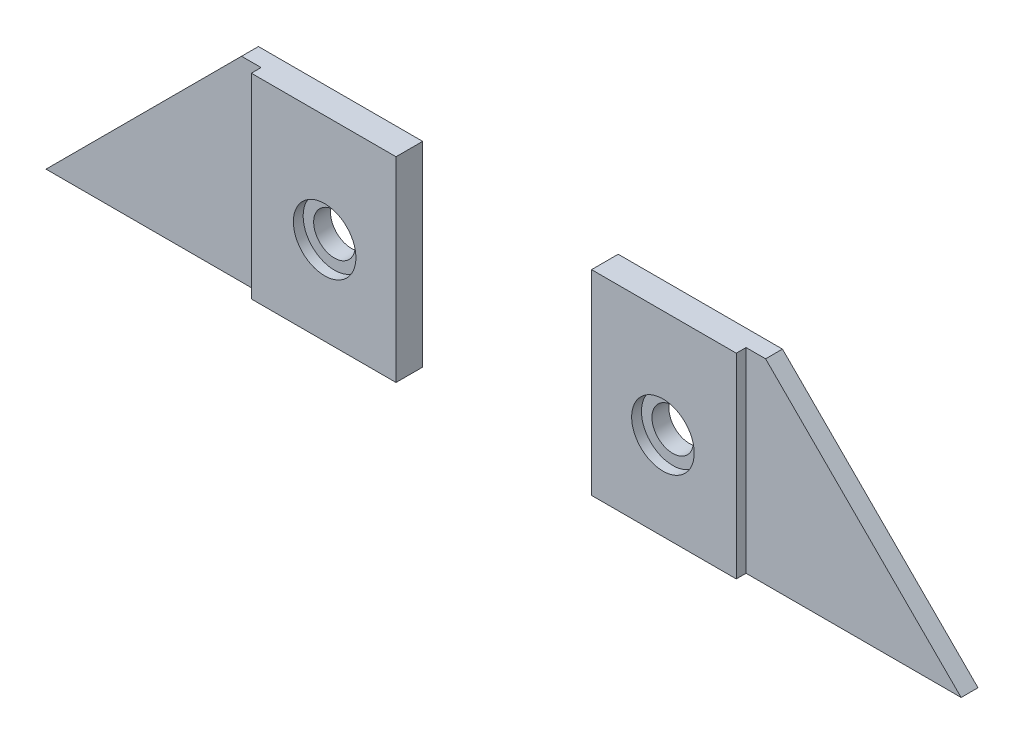
ISO-10303-21;
HEADER;
FILE_DESCRIPTION(('STEP AP214'),'2;1');
FILE_NAME('part.step','',(''),(''),'','','');
FILE_SCHEMA(('AUTOMOTIVE_DESIGN { 1 0 10303 214 1 1 1 1 }'));
ENDSEC;
DATA;
#1=APPLICATION_CONTEXT('core data for automotive mechanical design processes');
#2=APPLICATION_PROTOCOL_DEFINITION('international standard','automotive_design',2000,#1);
#3=PRODUCT_CONTEXT('',#1,'mechanical');
#4=PRODUCT('Part','Part','',(#3));
#5=PRODUCT_RELATED_PRODUCT_CATEGORY('part','',(#4));
#6=PRODUCT_DEFINITION_FORMATION('','',#4);
#7=PRODUCT_DEFINITION_CONTEXT('part definition',#1,'design');
#8=PRODUCT_DEFINITION('design','',#6,#7);
#9=PRODUCT_DEFINITION_SHAPE('','',#8);
#10=(LENGTH_UNIT() NAMED_UNIT(*) SI_UNIT(.MILLI.,.METRE.));
#11=(NAMED_UNIT(*) PLANE_ANGLE_UNIT() SI_UNIT($,.RADIAN.));
#12=(NAMED_UNIT(*) SI_UNIT($,.STERADIAN.) SOLID_ANGLE_UNIT());
#13=UNCERTAINTY_MEASURE_WITH_UNIT(LENGTH_MEASURE(1.E-05),#10,'distance_accuracy_value','');
#14=(GEOMETRIC_REPRESENTATION_CONTEXT(3) GLOBAL_UNCERTAINTY_ASSIGNED_CONTEXT((#13)) GLOBAL_UNIT_ASSIGNED_CONTEXT((#10,
#11,#12)) REPRESENTATION_CONTEXT('',''));
#15=CARTESIAN_POINT('',(0.,0.,0.));
#16=DIRECTION('',(0.,0.,1.));
#17=DIRECTION('',(1.,0.,0.));
#18=AXIS2_PLACEMENT_3D('',#15,#16,#17);
#19=CARTESIAN_POINT('',(-45.7,-1.,-1.6375));
#20=DIRECTION('',(0.,0.,1.));
#21=DIRECTION('',(-1.,0.,0.));
#22=AXIS2_PLACEMENT_3D('',#19,#20,#21);
#23=CYLINDRICAL_SURFACE('',#22,2.125);
#24=CARTESIAN_POINT('',(-45.7,-1.,-1.3625));
#25=DIRECTION('',(0.,0.,1.));
#26=DIRECTION('',(1.,0.,0.));
#27=AXIS2_PLACEMENT_3D('',#24,#25,#26);
#28=CIRCLE('',#27,2.125);
#29=CARTESIAN_POINT('',(-43.575,-1.,-1.3625));
#30=VERTEX_POINT('',#29);
#31=EDGE_CURVE('E116',#30,#30,#28,.T.);
#32=ORIENTED_EDGE('',*,*,#31,.F.);
#33=EDGE_LOOP('',(#32));
#34=FACE_BOUND('',#33,.T.);
#35=CARTESIAN_POINT('',(-45.7,-1.,0.362500000000002));
#36=DIRECTION('',(0.,0.,-1.));
#37=DIRECTION('',(-1.,0.,0.));
#38=AXIS2_PLACEMENT_3D('',#35,#36,#37);
#39=CIRCLE('',#38,2.125);
#40=CARTESIAN_POINT('',(-47.825,-1.,0.362500000000002));
#41=VERTEX_POINT('',#40);
#42=EDGE_CURVE('E46',#41,#41,#39,.F.);
#43=ORIENTED_EDGE('',*,*,#42,.T.);
#44=EDGE_LOOP('',(#43));
#45=FACE_BOUND('',#44,.T.);
#46=ADVANCED_FACE('F42',(#34,#45),#23,.F.);
#47=CARTESIAN_POINT('',(-53.2,-10.,0.362500000000002));
#48=DIRECTION('',(-1.,0.,0.));
#49=DIRECTION('',(0.,0.,-1.));
#50=AXIS2_PLACEMENT_3D('',#47,#48,#49);
#51=PLANE('',#50);
#52=DIRECTION('',(0.,1.,0.));
#53=VECTOR('',#52,1.);
#54=CARTESIAN_POINT('',(-53.2,-10.,0.362500000000002));
#55=LINE('',#54,#53);
#56=CARTESIAN_POINT('',(-53.2,-10.,0.362500000000002));
#57=VERTEX_POINT('',#56);
#58=CARTESIAN_POINT('',(-53.2,10.,0.362500000000002));
#59=VERTEX_POINT('',#58);
#60=EDGE_CURVE('E109',#57,#59,#55,.T.);
#61=ORIENTED_EDGE('',*,*,#60,.F.);
#62=DIRECTION('',(0.,0.,-1.));
#63=VECTOR('',#62,1.);
#64=CARTESIAN_POINT('',(-53.2,-10.,0.362500000000002));
#65=LINE('',#64,#63);
#66=CARTESIAN_POINT('',(-53.2,-10.,1.3625));
#67=VERTEX_POINT('',#66);
#68=EDGE_CURVE('E130',#67,#57,#65,.T.);
#69=ORIENTED_EDGE('',*,*,#68,.F.);
#70=DIRECTION('',(0.,1.,0.));
#71=VECTOR('',#70,1.);
#72=CARTESIAN_POINT('',(-53.2,-10.,1.3625));
#73=LINE('',#72,#71);
#74=CARTESIAN_POINT('',(-53.2,10.,1.3625));
#75=VERTEX_POINT('',#74);
#76=EDGE_CURVE('E51',#67,#75,#73,.T.);
#77=ORIENTED_EDGE('',*,*,#76,.T.);
#78=DIRECTION('',(0.,0.,-1.));
#79=VECTOR('',#78,1.);
#80=CARTESIAN_POINT('',(-53.2,10.,0.362500000000002));
#81=LINE('',#80,#79);
#82=EDGE_CURVE('E110',#75,#59,#81,.T.);
#83=ORIENTED_EDGE('',*,*,#82,.T.);
#84=EDGE_LOOP('',(#61,#69,#77,#83));
#85=FACE_BOUND('',#84,.T.);
#86=ADVANCED_FACE('F44',(#85),#51,.T.);
#87=CARTESIAN_POINT('',(-38.4,-10.,1.3625));
#88=DIRECTION('',(0.,0.,1.));
#89=DIRECTION('',(-1.,0.,0.));
#90=AXIS2_PLACEMENT_3D('',#87,#88,#89);
#91=PLANE('',#90);
#92=CARTESIAN_POINT('',(-45.7,-1.,1.3625));
#93=DIRECTION('',(0.,0.,-1.));
#94=DIRECTION('',(-1.,0.,0.));
#95=AXIS2_PLACEMENT_3D('',#92,#93,#94);
#96=CIRCLE('',#95,3.2);
#97=CARTESIAN_POINT('',(-48.9,-1.,1.3625));
#98=VERTEX_POINT('',#97);
#99=EDGE_CURVE('E121',#98,#98,#96,.T.);
#100=ORIENTED_EDGE('',*,*,#99,.T.);
#101=EDGE_LOOP('',(#100));
#102=FACE_BOUND('',#101,.T.);
#103=ORIENTED_EDGE('',*,*,#76,.F.);
#104=DIRECTION('',(-1.,0.,0.));
#105=VECTOR('',#104,1.);
#106=CARTESIAN_POINT('',(-38.4,-10.,1.3625));
#107=LINE('',#106,#105);
#108=CARTESIAN_POINT('',(-38.4,-10.,1.3625));
#109=VERTEX_POINT('',#108);
#110=EDGE_CURVE('E65',#109,#67,#107,.T.);
#111=ORIENTED_EDGE('',*,*,#110,.F.);
#112=DIRECTION('',(0.,1.,0.));
#113=VECTOR('',#112,1.);
#114=CARTESIAN_POINT('',(-38.4,-10.,1.3625));
#115=LINE('',#114,#113);
#116=CARTESIAN_POINT('',(-38.4,10.,1.3625));
#117=VERTEX_POINT('',#116);
#118=EDGE_CURVE('E142',#109,#117,#115,.T.);
#119=ORIENTED_EDGE('',*,*,#118,.T.);
#120=DIRECTION('',(-1.,0.,0.));
#121=VECTOR('',#120,1.);
#122=CARTESIAN_POINT('',(-38.4,10.,1.3625));
#123=LINE('',#122,#121);
#124=EDGE_CURVE('E128',#117,#75,#123,.T.);
#125=ORIENTED_EDGE('',*,*,#124,.T.);
#126=EDGE_LOOP('',(#103,#111,#119,#125));
#127=FACE_BOUND('',#126,.T.);
#128=ADVANCED_FACE('F158',(#102,#127),#91,.T.);
#129=CARTESIAN_POINT('',(-38.4,-10.,-1.3625));
#130=DIRECTION('',(1.,0.,0.));
#131=DIRECTION('',(0.,0.,1.));
#132=AXIS2_PLACEMENT_3D('',#129,#130,#131);
#133=PLANE('',#132);
#134=ORIENTED_EDGE('',*,*,#118,.F.);
#135=DIRECTION('',(0.,0.,1.));
#136=VECTOR('',#135,1.);
#137=CARTESIAN_POINT('',(-38.4,-10.,-1.3625));
#138=LINE('',#137,#136);
#139=CARTESIAN_POINT('',(-38.4,-10.,-1.3625));
#140=VERTEX_POINT('',#139);
#141=EDGE_CURVE('E137',#140,#109,#138,.T.);
#142=ORIENTED_EDGE('',*,*,#141,.F.);
#143=DIRECTION('',(0.,1.,0.));
#144=VECTOR('',#143,1.);
#145=CARTESIAN_POINT('',(-38.4,-10.,-1.3625));
#146=LINE('',#145,#144);
#147=CARTESIAN_POINT('',(-38.4,10.,-1.3625));
#148=VERTEX_POINT('',#147);
#149=EDGE_CURVE('E145',#140,#148,#146,.T.);
#150=ORIENTED_EDGE('',*,*,#149,.T.);
#151=DIRECTION('',(0.,0.,1.));
#152=VECTOR('',#151,1.);
#153=CARTESIAN_POINT('',(-38.4,10.,-1.3625));
#154=LINE('',#153,#152);
#155=EDGE_CURVE('E126',#148,#117,#154,.T.);
#156=ORIENTED_EDGE('',*,*,#155,.T.);
#157=EDGE_LOOP('',(#134,#142,#150,#156));
#158=FACE_BOUND('',#157,.T.);
#159=ADVANCED_FACE('F152',(#158),#133,.T.);
#160=CARTESIAN_POINT('',(-38.4,-10.,-1.3625));
#161=DIRECTION('',(0.,0.,-1.));
#162=DIRECTION('',(1.,0.,0.));
#163=AXIS2_PLACEMENT_3D('',#160,#161,#162);
#164=PLANE('',#163);
#165=ORIENTED_EDGE('',*,*,#31,.T.);
#166=EDGE_LOOP('',(#165));
#167=FACE_BOUND('',#166,.T.);
#168=DIRECTION('',(0.707106781186548,0.707106781186548,0.));
#169=VECTOR('',#168,1.);
#170=CARTESIAN_POINT('',(-56.8,8.4,-1.3625));
#171=LINE('',#170,#169);
#172=CARTESIAN_POINT('',(-75.2,-10.,-1.3625));
#173=VERTEX_POINT('',#172);
#174=CARTESIAN_POINT('',(-55.2,10.,-1.3625));
#175=VERTEX_POINT('',#174);
#176=EDGE_CURVE('E115',#173,#175,#171,.T.);
#177=ORIENTED_EDGE('',*,*,#176,.T.);
#178=DIRECTION('',(1.,0.,0.));
#179=VECTOR('',#178,1.);
#180=CARTESIAN_POINT('',(-38.4,10.,-1.3625));
#181=LINE('',#180,#179);
#182=EDGE_CURVE('E101',#175,#148,#181,.T.);
#183=ORIENTED_EDGE('',*,*,#182,.T.);
#184=ORIENTED_EDGE('',*,*,#149,.F.);
#185=DIRECTION('',(1.,0.,0.));
#186=VECTOR('',#185,1.);
#187=CARTESIAN_POINT('',(-38.4,-10.,-1.3625));
#188=LINE('',#187,#186);
#189=EDGE_CURVE('E135',#173,#140,#188,.T.);
#190=ORIENTED_EDGE('',*,*,#189,.F.);
#191=EDGE_LOOP('',(#177,#183,#184,#190));
#192=FACE_BOUND('',#191,.T.);
#193=ADVANCED_FACE('F156',(#167,#192),#164,.T.);
#194=CARTESIAN_POINT('',(-53.2,-10.,0.362500000000002));
#195=DIRECTION('',(0.,0.,1.));
#196=DIRECTION('',(-1.,0.,0.));
#197=AXIS2_PLACEMENT_3D('',#194,#195,#196);
#198=PLANE('',#197);
#199=DIRECTION('',(-0.707106781186548,-0.707106781186548,0.));
#200=VECTOR('',#199,1.);
#201=CARTESIAN_POINT('',(-55.2,10.,0.362500000000002));
#202=LINE('',#201,#200);
#203=CARTESIAN_POINT('',(-55.2,10.,0.362500000000002));
#204=VERTEX_POINT('',#203);
#205=CARTESIAN_POINT('',(-75.2,-10.,0.362500000000002));
#206=VERTEX_POINT('',#205);
#207=EDGE_CURVE('E107',#204,#206,#202,.T.);
#208=ORIENTED_EDGE('',*,*,#207,.T.);
#209=DIRECTION('',(-1.,0.,0.));
#210=VECTOR('',#209,1.);
#211=CARTESIAN_POINT('',(-53.2,-10.,0.362500000000002));
#212=LINE('',#211,#210);
#213=EDGE_CURVE('E132',#57,#206,#212,.T.);
#214=ORIENTED_EDGE('',*,*,#213,.F.);
#215=ORIENTED_EDGE('',*,*,#60,.T.);
#216=DIRECTION('',(-1.,0.,0.));
#217=VECTOR('',#216,1.);
#218=CARTESIAN_POINT('',(-53.2,10.,0.362500000000002));
#219=LINE('',#218,#217);
#220=EDGE_CURVE('E98',#59,#204,#219,.T.);
#221=ORIENTED_EDGE('',*,*,#220,.T.);
#222=EDGE_LOOP('',(#208,#214,#215,#221));
#223=FACE_BOUND('',#222,.T.);
#224=ADVANCED_FACE('F106',(#223),#198,.T.);
#225=CARTESIAN_POINT('',(-56.8,-10.,0.));
#226=DIRECTION('',(0.,1.,0.));
#227=DIRECTION('',(0.,0.,1.));
#228=AXIS2_PLACEMENT_3D('',#225,#226,#227);
#229=PLANE('',#228);
#230=ORIENTED_EDGE('',*,*,#68,.T.);
#231=ORIENTED_EDGE('',*,*,#213,.T.);
#232=DIRECTION('',(0.,0.,-1.));
#233=VECTOR('',#232,1.);
#234=CARTESIAN_POINT('',(-75.2,-10.,-1.3625));
#235=LINE('',#234,#233);
#236=EDGE_CURVE('E113',#206,#173,#235,.T.);
#237=ORIENTED_EDGE('',*,*,#236,.T.);
#238=ORIENTED_EDGE('',*,*,#189,.T.);
#239=ORIENTED_EDGE('',*,*,#141,.T.);
#240=ORIENTED_EDGE('',*,*,#110,.T.);
#241=EDGE_LOOP('',(#230,#231,#237,#238,#239,#240));
#242=FACE_BOUND('',#241,.T.);
#243=ADVANCED_FACE('F161',(#242),#229,.F.);
#244=CARTESIAN_POINT('',(-56.8,10.,0.));
#245=DIRECTION('',(0.,1.,0.));
#246=DIRECTION('',(0.,0.,1.));
#247=AXIS2_PLACEMENT_3D('',#244,#245,#246);
#248=PLANE('',#247);
#249=DIRECTION('',(0.,0.,1.));
#250=VECTOR('',#249,1.);
#251=CARTESIAN_POINT('',(-55.2,10.,0.));
#252=LINE('',#251,#250);
#253=EDGE_CURVE('E12',#175,#204,#252,.T.);
#254=ORIENTED_EDGE('',*,*,#253,.T.);
#255=ORIENTED_EDGE('',*,*,#220,.F.);
#256=ORIENTED_EDGE('',*,*,#82,.F.);
#257=ORIENTED_EDGE('',*,*,#124,.F.);
#258=ORIENTED_EDGE('',*,*,#155,.F.);
#259=ORIENTED_EDGE('',*,*,#182,.F.);
#260=EDGE_LOOP('',(#254,#255,#256,#257,#258,#259));
#261=FACE_BOUND('',#260,.T.);
#262=ADVANCED_FACE('F96',(#261),#248,.T.);
#263=CARTESIAN_POINT('',(-55.2,10.,-1.6375));
#264=DIRECTION('',(0.707106781186547,-0.707106781186547,0.));
#265=DIRECTION('',(-0.707106781186548,-0.707106781186548,0.));
#266=AXIS2_PLACEMENT_3D('',#263,#264,#265);
#267=PLANE('',#266);
#268=ORIENTED_EDGE('',*,*,#176,.F.);
#269=ORIENTED_EDGE('',*,*,#236,.F.);
#270=ORIENTED_EDGE('',*,*,#207,.F.);
#271=ORIENTED_EDGE('',*,*,#253,.F.);
#272=EDGE_LOOP('',(#268,#269,#270,#271));
#273=FACE_BOUND('',#272,.T.);
#274=ADVANCED_FACE('F112',(#273),#267,.F.);
#275=CARTESIAN_POINT('',(-45.7,-1.,0.362500000000002));
#276=DIRECTION('',(0.,0.,1.));
#277=DIRECTION('',(-1.,0.,0.));
#278=AXIS2_PLACEMENT_3D('',#275,#276,#277);
#279=PLANE('',#278);
#280=CARTESIAN_POINT('',(-45.7,-1.,0.362500000000002));
#281=DIRECTION('',(0.,0.,-1.));
#282=DIRECTION('',(-1.,0.,0.));
#283=AXIS2_PLACEMENT_3D('',#280,#281,#282);
#284=CIRCLE('',#283,3.2);
#285=CARTESIAN_POINT('',(-48.9,-1.,0.362500000000002));
#286=VERTEX_POINT('',#285);
#287=EDGE_CURVE('E195',#286,#286,#284,.T.);
#288=ORIENTED_EDGE('',*,*,#287,.F.);
#289=EDGE_LOOP('',(#288));
#290=FACE_BOUND('',#289,.T.);
#291=ORIENTED_EDGE('',*,*,#42,.F.);
#292=EDGE_LOOP('',(#291));
#293=FACE_BOUND('',#292,.T.);
#294=ADVANCED_FACE('F183',(#290,#293),#279,.T.);
#295=CARTESIAN_POINT('',(-45.7,-1.,0.362500000000002));
#296=DIRECTION('',(0.,0.,1.));
#297=DIRECTION('',(-1.,0.,0.));
#298=AXIS2_PLACEMENT_3D('',#295,#296,#297);
#299=CYLINDRICAL_SURFACE('',#298,3.2);
#300=ORIENTED_EDGE('',*,*,#287,.T.);
#301=EDGE_LOOP('',(#300));
#302=FACE_BOUND('',#301,.T.);
#303=ORIENTED_EDGE('',*,*,#99,.F.);
#304=EDGE_LOOP('',(#303));
#305=FACE_BOUND('',#304,.T.);
#306=ADVANCED_FACE('F180',(#302,#305),#299,.F.);
#307=CLOSED_SHELL('',(#46,#86,#128,#159,#193,#224,#243,#262,#274,#294,#306));
#308=MANIFOLD_SOLID_BREP('B2',#307);
#309=CARTESIAN_POINT('',(-11.1,-1.,-1.6375));
#310=DIRECTION('',(0.,0.,1.));
#311=DIRECTION('',(1.,0.,0.));
#312=AXIS2_PLACEMENT_3D('',#309,#310,#311);
#313=CYLINDRICAL_SURFACE('',#312,2.125);
#314=CARTESIAN_POINT('',(-11.1,-1.,-1.3625));
#315=DIRECTION('',(0.,0.,-1.));
#316=DIRECTION('',(-1.,0.,0.));
#317=AXIS2_PLACEMENT_3D('',#314,#315,#316);
#318=CIRCLE('',#317,2.125);
#319=CARTESIAN_POINT('',(-13.225,-1.,-1.3625));
#320=VERTEX_POINT('',#319);
#321=EDGE_CURVE('E334',#320,#320,#318,.T.);
#322=ORIENTED_EDGE('',*,*,#321,.T.);
#323=EDGE_LOOP('',(#322));
#324=FACE_BOUND('',#323,.T.);
#325=CARTESIAN_POINT('',(-11.1,-1.,0.362500000000002));
#326=DIRECTION('',(0.,0.,1.));
#327=DIRECTION('',(1.,0.,0.));
#328=AXIS2_PLACEMENT_3D('',#325,#326,#327);
#329=CIRCLE('',#328,2.125);
#330=CARTESIAN_POINT('',(-8.975,-1.,0.362500000000002));
#331=VERTEX_POINT('',#330);
#332=EDGE_CURVE('E272',#331,#331,#329,.F.);
#333=ORIENTED_EDGE('',*,*,#332,.F.);
#334=EDGE_LOOP('',(#333));
#335=FACE_BOUND('',#334,.T.);
#336=ADVANCED_FACE('F268',(#324,#335),#313,.F.);
#337=CARTESIAN_POINT('',(-3.6,-10.,0.362500000000002));
#338=DIRECTION('',(1.,0.,0.));
#339=DIRECTION('',(0.,0.,-1.));
#340=AXIS2_PLACEMENT_3D('',#337,#338,#339);
#341=PLANE('',#340);
#342=DIRECTION('',(0.,1.,0.));
#343=VECTOR('',#342,1.);
#344=CARTESIAN_POINT('',(-3.6,-10.,0.362500000000002));
#345=LINE('',#344,#343);
#346=CARTESIAN_POINT('',(-3.6,-10.,0.362500000000002));
#347=VERTEX_POINT('',#346);
#348=CARTESIAN_POINT('',(-3.6,10.,0.362500000000002));
#349=VERTEX_POINT('',#348);
#350=EDGE_CURVE('E364',#347,#349,#345,.T.);
#351=ORIENTED_EDGE('',*,*,#350,.T.);
#352=DIRECTION('',(0.,0.,-1.));
#353=VECTOR('',#352,1.);
#354=CARTESIAN_POINT('',(-3.6,10.,0.362500000000002));
#355=LINE('',#354,#353);
#356=CARTESIAN_POINT('',(-3.6,10.,1.3625));
#357=VERTEX_POINT('',#356);
#358=EDGE_CURVE('E338',#357,#349,#355,.T.);
#359=ORIENTED_EDGE('',*,*,#358,.F.);
#360=DIRECTION('',(0.,1.,0.));
#361=VECTOR('',#360,1.);
#362=CARTESIAN_POINT('',(-3.6,-10.,1.3625));
#363=LINE('',#362,#361);
#364=CARTESIAN_POINT('',(-3.6,-10.,1.3625));
#365=VERTEX_POINT('',#364);
#366=EDGE_CURVE('E277',#365,#357,#363,.T.);
#367=ORIENTED_EDGE('',*,*,#366,.F.);
#368=DIRECTION('',(0.,0.,-1.));
#369=VECTOR('',#368,1.);
#370=CARTESIAN_POINT('',(-3.6,-10.,0.362500000000002));
#371=LINE('',#370,#369);
#372=EDGE_CURVE('E350',#365,#347,#371,.T.);
#373=ORIENTED_EDGE('',*,*,#372,.T.);
#374=EDGE_LOOP('',(#351,#359,#367,#373));
#375=FACE_BOUND('',#374,.T.);
#376=ADVANCED_FACE('F270',(#375),#341,.T.);
#377=CARTESIAN_POINT('',(-18.4,-10.,1.3625));
#378=DIRECTION('',(0.,0.,1.));
#379=DIRECTION('',(1.,0.,0.));
#380=AXIS2_PLACEMENT_3D('',#377,#378,#379);
#381=PLANE('',#380);
#382=CARTESIAN_POINT('',(-11.1,-1.,1.3625));
#383=DIRECTION('',(0.,0.,1.));
#384=DIRECTION('',(1.,0.,0.));
#385=AXIS2_PLACEMENT_3D('',#382,#383,#384);
#386=CIRCLE('',#385,3.2);
#387=CARTESIAN_POINT('',(-7.9,-1.,1.3625));
#388=VERTEX_POINT('',#387);
#389=EDGE_CURVE('E379',#388,#388,#386,.T.);
#390=ORIENTED_EDGE('',*,*,#389,.F.);
#391=EDGE_LOOP('',(#390));
#392=FACE_BOUND('',#391,.T.);
#393=ORIENTED_EDGE('',*,*,#366,.T.);
#394=DIRECTION('',(1.,0.,0.));
#395=VECTOR('',#394,1.);
#396=CARTESIAN_POINT('',(-18.4,10.,1.3625));
#397=LINE('',#396,#395);
#398=CARTESIAN_POINT('',(-18.4,10.,1.3625));
#399=VERTEX_POINT('',#398);
#400=EDGE_CURVE('E348',#399,#357,#397,.T.);
#401=ORIENTED_EDGE('',*,*,#400,.F.);
#402=DIRECTION('',(0.,1.,0.));
#403=VECTOR('',#402,1.);
#404=CARTESIAN_POINT('',(-18.4,-10.,1.3625));
#405=LINE('',#404,#403);
#406=CARTESIAN_POINT('',(-18.4,-10.,1.3625));
#407=VERTEX_POINT('',#406);
#408=EDGE_CURVE('E366',#407,#399,#405,.T.);
#409=ORIENTED_EDGE('',*,*,#408,.F.);
#410=DIRECTION('',(1.,0.,0.));
#411=VECTOR('',#410,1.);
#412=CARTESIAN_POINT('',(-18.4,-10.,1.3625));
#413=LINE('',#412,#411);
#414=EDGE_CURVE('E361',#407,#365,#413,.T.);
#415=ORIENTED_EDGE('',*,*,#414,.T.);
#416=EDGE_LOOP('',(#393,#401,#409,#415));
#417=FACE_BOUND('',#416,.T.);
#418=ADVANCED_FACE('F389',(#392,#417),#381,.T.);
#419=CARTESIAN_POINT('',(-18.4,-10.,-1.3625));
#420=DIRECTION('',(-1.,0.,0.));
#421=DIRECTION('',(0.,0.,1.));
#422=AXIS2_PLACEMENT_3D('',#419,#420,#421);
#423=PLANE('',#422);
#424=ORIENTED_EDGE('',*,*,#408,.T.);
#425=DIRECTION('',(0.,0.,1.));
#426=VECTOR('',#425,1.);
#427=CARTESIAN_POINT('',(-18.4,10.,-1.3625));
#428=LINE('',#427,#426);
#429=CARTESIAN_POINT('',(-18.4,10.,-1.3625));
#430=VERTEX_POINT('',#429);
#431=EDGE_CURVE('E341',#430,#399,#428,.T.);
#432=ORIENTED_EDGE('',*,*,#431,.F.);
#433=DIRECTION('',(0.,1.,0.));
#434=VECTOR('',#433,1.);
#435=CARTESIAN_POINT('',(-18.4,-10.,-1.3625));
#436=LINE('',#435,#434);
#437=CARTESIAN_POINT('',(-18.4,-10.,-1.3625));
#438=VERTEX_POINT('',#437);
#439=EDGE_CURVE('E368',#438,#430,#436,.T.);
#440=ORIENTED_EDGE('',*,*,#439,.F.);
#441=DIRECTION('',(0.,0.,1.));
#442=VECTOR('',#441,1.);
#443=CARTESIAN_POINT('',(-18.4,-10.,-1.3625));
#444=LINE('',#443,#442);
#445=EDGE_CURVE('E358',#438,#407,#444,.T.);
#446=ORIENTED_EDGE('',*,*,#445,.T.);
#447=EDGE_LOOP('',(#424,#432,#440,#446));
#448=FACE_BOUND('',#447,.T.);
#449=ADVANCED_FACE('F392',(#448),#423,.T.);
#450=CARTESIAN_POINT('',(-18.4,-10.,-1.3625));
#451=DIRECTION('',(0.,0.,-1.));
#452=DIRECTION('',(-1.,0.,0.));
#453=AXIS2_PLACEMENT_3D('',#450,#451,#452);
#454=PLANE('',#453);
#455=ORIENTED_EDGE('',*,*,#321,.F.);
#456=EDGE_LOOP('',(#455));
#457=FACE_BOUND('',#456,.T.);
#458=DIRECTION('',(-0.707106781186548,0.707106781186548,0.));
#459=VECTOR('',#458,1.);
#460=CARTESIAN_POINT('',(0.,8.4,-1.3625));
#461=LINE('',#460,#459);
#462=CARTESIAN_POINT('',(18.4,-10.,-1.3625));
#463=VERTEX_POINT('',#462);
#464=CARTESIAN_POINT('',(-1.6,10.,-1.3625));
#465=VERTEX_POINT('',#464);
#466=EDGE_CURVE('E284',#463,#465,#461,.T.);
#467=ORIENTED_EDGE('',*,*,#466,.F.);
#468=DIRECTION('',(-1.,0.,0.));
#469=VECTOR('',#468,1.);
#470=CARTESIAN_POINT('',(-18.4,-10.,-1.3625));
#471=LINE('',#470,#469);
#472=EDGE_CURVE('E355',#463,#438,#471,.T.);
#473=ORIENTED_EDGE('',*,*,#472,.T.);
#474=ORIENTED_EDGE('',*,*,#439,.T.);
#475=DIRECTION('',(-1.,0.,0.));
#476=VECTOR('',#475,1.);
#477=CARTESIAN_POINT('',(-18.4,10.,-1.3625));
#478=LINE('',#477,#476);
#479=EDGE_CURVE('E339',#465,#430,#478,.T.);
#480=ORIENTED_EDGE('',*,*,#479,.F.);
#481=EDGE_LOOP('',(#467,#473,#474,#480));
#482=FACE_BOUND('',#481,.T.);
#483=ADVANCED_FACE('F402',(#457,#482),#454,.T.);
#484=CARTESIAN_POINT('',(-3.6,-10.,0.362500000000002));
#485=DIRECTION('',(0.,0.,1.));
#486=DIRECTION('',(1.,0.,0.));
#487=AXIS2_PLACEMENT_3D('',#484,#485,#486);
#488=PLANE('',#487);
#489=DIRECTION('',(0.707106781186548,-0.707106781186548,0.));
#490=VECTOR('',#489,1.);
#491=CARTESIAN_POINT('',(-1.6,10.,0.362500000000002));
#492=LINE('',#491,#490);
#493=CARTESIAN_POINT('',(-1.6,10.,0.362500000000002));
#494=VERTEX_POINT('',#493);
#495=CARTESIAN_POINT('',(18.4,-10.,0.362500000000002));
#496=VERTEX_POINT('',#495);
#497=EDGE_CURVE('E321',#494,#496,#492,.T.);
#498=ORIENTED_EDGE('',*,*,#497,.F.);
#499=DIRECTION('',(1.,0.,0.));
#500=VECTOR('',#499,1.);
#501=CARTESIAN_POINT('',(-3.6,10.,0.362500000000002));
#502=LINE('',#501,#500);
#503=EDGE_CURVE('E330',#349,#494,#502,.T.);
#504=ORIENTED_EDGE('',*,*,#503,.F.);
#505=ORIENTED_EDGE('',*,*,#350,.F.);
#506=DIRECTION('',(1.,0.,0.));
#507=VECTOR('',#506,1.);
#508=CARTESIAN_POINT('',(-3.6,-10.,0.362500000000002));
#509=LINE('',#508,#507);
#510=EDGE_CURVE('E333',#347,#496,#509,.T.);
#511=ORIENTED_EDGE('',*,*,#510,.T.);
#512=EDGE_LOOP('',(#498,#504,#505,#511));
#513=FACE_BOUND('',#512,.T.);
#514=ADVANCED_FACE('F329',(#513),#488,.T.);
#515=CARTESIAN_POINT('',(0.,-10.,0.));
#516=DIRECTION('',(0.,1.,0.));
#517=DIRECTION('',(0.,0.,1.));
#518=AXIS2_PLACEMENT_3D('',#515,#516,#517);
#519=PLANE('',#518);
#520=ORIENTED_EDGE('',*,*,#372,.F.);
#521=ORIENTED_EDGE('',*,*,#414,.F.);
#522=ORIENTED_EDGE('',*,*,#445,.F.);
#523=ORIENTED_EDGE('',*,*,#472,.F.);
#524=DIRECTION('',(0.,0.,-1.));
#525=VECTOR('',#524,1.);
#526=CARTESIAN_POINT('',(18.4,-10.,-1.3625));
#527=LINE('',#526,#525);
#528=EDGE_CURVE('E353',#496,#463,#527,.T.);
#529=ORIENTED_EDGE('',*,*,#528,.F.);
#530=ORIENTED_EDGE('',*,*,#510,.F.);
#531=EDGE_LOOP('',(#520,#521,#522,#523,#529,#530));
#532=FACE_BOUND('',#531,.T.);
#533=ADVANCED_FACE('F398',(#532),#519,.F.);
#534=CARTESIAN_POINT('',(0.,10.,0.));
#535=DIRECTION('',(0.,1.,0.));
#536=DIRECTION('',(0.,0.,1.));
#537=AXIS2_PLACEMENT_3D('',#534,#535,#536);
#538=PLANE('',#537);
#539=DIRECTION('',(0.,0.,1.));
#540=VECTOR('',#539,1.);
#541=CARTESIAN_POINT('',(-1.6,10.,0.));
#542=LINE('',#541,#540);
#543=EDGE_CURVE('E40',#465,#494,#542,.T.);
#544=ORIENTED_EDGE('',*,*,#543,.F.);
#545=ORIENTED_EDGE('',*,*,#479,.T.);
#546=ORIENTED_EDGE('',*,*,#431,.T.);
#547=ORIENTED_EDGE('',*,*,#400,.T.);
#548=ORIENTED_EDGE('',*,*,#358,.T.);
#549=ORIENTED_EDGE('',*,*,#503,.T.);
#550=EDGE_LOOP('',(#544,#545,#546,#547,#548,#549));
#551=FACE_BOUND('',#550,.T.);
#552=ADVANCED_FACE('F336',(#551),#538,.T.);
#553=CARTESIAN_POINT('',(-1.6,10.,-1.6375));
#554=DIRECTION('',(-0.707106781186547,-0.707106781186547,0.));
#555=DIRECTION('',(0.707106781186548,-0.707106781186548,0.));
#556=AXIS2_PLACEMENT_3D('',#553,#554,#555);
#557=PLANE('',#556);
#558=ORIENTED_EDGE('',*,*,#466,.T.);
#559=ORIENTED_EDGE('',*,*,#543,.T.);
#560=ORIENTED_EDGE('',*,*,#497,.T.);
#561=ORIENTED_EDGE('',*,*,#528,.T.);
#562=EDGE_LOOP('',(#558,#559,#560,#561));
#563=FACE_BOUND('',#562,.T.);
#564=ADVANCED_FACE('F320',(#563),#557,.F.);
#565=CARTESIAN_POINT('',(-11.1,-1.,0.362500000000002));
#566=DIRECTION('',(0.,0.,1.));
#567=DIRECTION('',(1.,0.,0.));
#568=AXIS2_PLACEMENT_3D('',#565,#566,#567);
#569=PLANE('',#568);
#570=CARTESIAN_POINT('',(-11.1,-1.,0.362500000000002));
#571=DIRECTION('',(0.,0.,1.));
#572=DIRECTION('',(1.,0.,0.));
#573=AXIS2_PLACEMENT_3D('',#570,#571,#572);
#574=CIRCLE('',#573,3.2);
#575=CARTESIAN_POINT('',(-7.9,-1.,0.362500000000002));
#576=VERTEX_POINT('',#575);
#577=EDGE_CURVE('E375',#576,#576,#574,.T.);
#578=ORIENTED_EDGE('',*,*,#577,.T.);
#579=EDGE_LOOP('',(#578));
#580=FACE_BOUND('',#579,.T.);
#581=ORIENTED_EDGE('',*,*,#332,.T.);
#582=EDGE_LOOP('',(#581));
#583=FACE_BOUND('',#582,.T.);
#584=ADVANCED_FACE('F422',(#580,#583),#569,.T.);
#585=CARTESIAN_POINT('',(-11.1,-1.,0.362500000000002));
#586=DIRECTION('',(0.,0.,1.));
#587=DIRECTION('',(1.,0.,0.));
#588=AXIS2_PLACEMENT_3D('',#585,#586,#587);
#589=CYLINDRICAL_SURFACE('',#588,3.2);
#590=ORIENTED_EDGE('',*,*,#577,.F.);
#591=EDGE_LOOP('',(#590));
#592=FACE_BOUND('',#591,.T.);
#593=ORIENTED_EDGE('',*,*,#389,.T.);
#594=EDGE_LOOP('',(#593));
#595=FACE_BOUND('',#594,.T.);
#596=ADVANCED_FACE('F387',(#592,#595),#589,.F.);
#597=CLOSED_SHELL('',(#336,#376,#418,#449,#483,#514,#533,#552,#564,#584,#596));
#598=MANIFOLD_SOLID_BREP('B6',#597);
#599=ADVANCED_BREP_SHAPE_REPRESENTATION('',(#18,#308,#598),#14);
#600=SHAPE_DEFINITION_REPRESENTATION(#9,#599);
ENDSEC;
END-ISO-10303-21;
